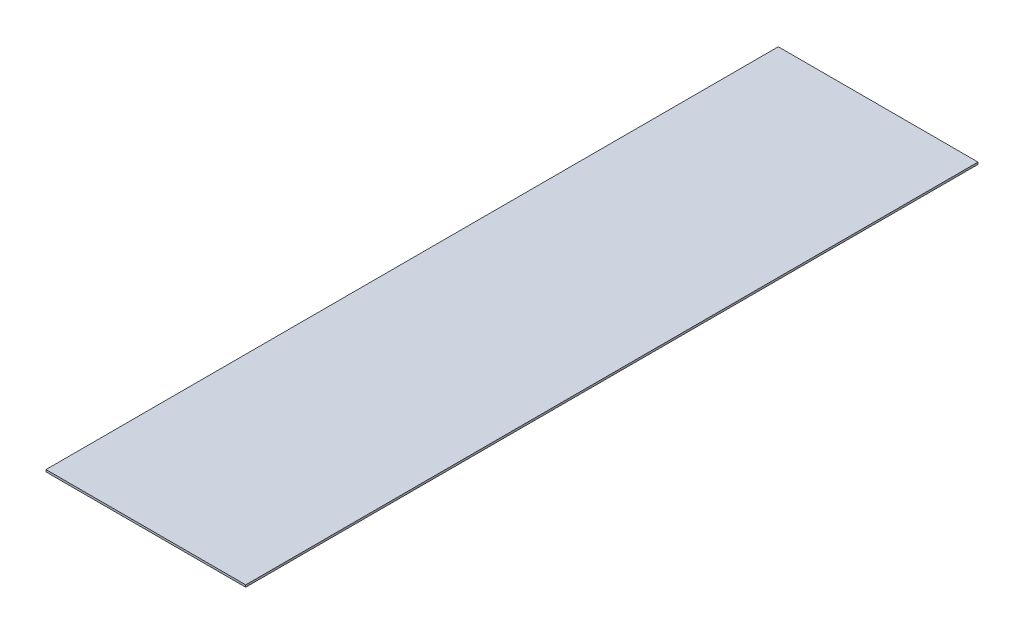
ISO-10303-21;
HEADER;
FILE_DESCRIPTION(('STEP AP214'),'2;1');
FILE_NAME('part.step','',(''),(''),'','','');
FILE_SCHEMA(('AUTOMOTIVE_DESIGN { 1 0 10303 214 1 1 1 1 }'));
ENDSEC;
DATA;
#1=APPLICATION_CONTEXT('core data for automotive mechanical design processes');
#2=APPLICATION_PROTOCOL_DEFINITION('international standard','automotive_design',2000,#1);
#3=PRODUCT_CONTEXT('',#1,'mechanical');
#4=PRODUCT('Part','Part','',(#3));
#5=PRODUCT_RELATED_PRODUCT_CATEGORY('part','',(#4));
#6=PRODUCT_DEFINITION_FORMATION('','',#4);
#7=PRODUCT_DEFINITION_CONTEXT('part definition',#1,'design');
#8=PRODUCT_DEFINITION('design','',#6,#7);
#9=PRODUCT_DEFINITION_SHAPE('','',#8);
#10=(LENGTH_UNIT() NAMED_UNIT(*) SI_UNIT(.MILLI.,.METRE.));
#11=(NAMED_UNIT(*) PLANE_ANGLE_UNIT() SI_UNIT($,.RADIAN.));
#12=(NAMED_UNIT(*) SI_UNIT($,.STERADIAN.) SOLID_ANGLE_UNIT());
#13=UNCERTAINTY_MEASURE_WITH_UNIT(LENGTH_MEASURE(1.E-05),#10,'distance_accuracy_value','');
#14=(GEOMETRIC_REPRESENTATION_CONTEXT(3) GLOBAL_UNCERTAINTY_ASSIGNED_CONTEXT((#13)) GLOBAL_UNIT_ASSIGNED_CONTEXT((#10,
#11,#12)) REPRESENTATION_CONTEXT('',''));
#15=CARTESIAN_POINT('',(0.,0.,0.));
#16=DIRECTION('',(0.,0.,1.));
#17=DIRECTION('',(1.,0.,0.));
#18=AXIS2_PLACEMENT_3D('',#15,#16,#17);
#19=CARTESIAN_POINT('',(-38.1,0.79375,-139.7));
#20=DIRECTION('',(1.,0.,0.));
#21=DIRECTION('',(0.,0.,-1.));
#22=AXIS2_PLACEMENT_3D('',#19,#20,#21);
#23=PLANE('',#22);
#24=DIRECTION('',(0.,0.,1.));
#25=VECTOR('',#24,1.);
#26=CARTESIAN_POINT('',(-38.1,0.,-139.7));
#27=LINE('',#26,#25);
#28=CARTESIAN_POINT('',(-38.1,0.,-139.7));
#29=VERTEX_POINT('',#28);
#30=CARTESIAN_POINT('',(-38.1,0.,139.7));
#31=VERTEX_POINT('',#30);
#32=EDGE_CURVE('E108',#29,#31,#27,.T.);
#33=ORIENTED_EDGE('',*,*,#32,.T.);
#34=DIRECTION('',(0.,-1.,0.));
#35=VECTOR('',#34,1.);
#36=CARTESIAN_POINT('',(-38.1,0.79375,139.7));
#37=LINE('',#36,#35);
#38=CARTESIAN_POINT('',(-38.1,0.79375,139.7));
#39=VERTEX_POINT('',#38);
#40=EDGE_CURVE('E11',#39,#31,#37,.T.);
#41=ORIENTED_EDGE('',*,*,#40,.F.);
#42=DIRECTION('',(0.,0.,1.));
#43=VECTOR('',#42,1.);
#44=CARTESIAN_POINT('',(-38.1,0.79375,-139.7));
#45=LINE('',#44,#43);
#46=CARTESIAN_POINT('',(-38.1,0.79375,-139.7));
#47=VERTEX_POINT('',#46);
#48=EDGE_CURVE('E92',#47,#39,#45,.T.);
#49=ORIENTED_EDGE('',*,*,#48,.F.);
#50=DIRECTION('',(0.,-1.,0.));
#51=VECTOR('',#50,1.);
#52=CARTESIAN_POINT('',(-38.1,0.79375,-139.7));
#53=LINE('',#52,#51);
#54=EDGE_CURVE('E104',#47,#29,#53,.T.);
#55=ORIENTED_EDGE('',*,*,#54,.T.);
#56=EDGE_LOOP('',(#33,#41,#49,#55));
#57=FACE_BOUND('',#56,.T.);
#58=ADVANCED_FACE('F40',(#57),#23,.F.);
#59=CARTESIAN_POINT('',(-38.1,0.79375,139.7));
#60=DIRECTION('',(0.,0.,-1.));
#61=DIRECTION('',(-1.,0.,0.));
#62=AXIS2_PLACEMENT_3D('',#59,#60,#61);
#63=PLANE('',#62);
#64=DIRECTION('',(1.,0.,0.));
#65=VECTOR('',#64,1.);
#66=CARTESIAN_POINT('',(-38.1,0.,139.7));
#67=LINE('',#66,#65);
#68=CARTESIAN_POINT('',(38.1,0.,139.7));
#69=VERTEX_POINT('',#68);
#70=EDGE_CURVE('E97',#31,#69,#67,.T.);
#71=ORIENTED_EDGE('',*,*,#70,.T.);
#72=DIRECTION('',(0.,-1.,0.));
#73=VECTOR('',#72,1.);
#74=CARTESIAN_POINT('',(38.1,0.79375,139.7));
#75=LINE('',#74,#73);
#76=CARTESIAN_POINT('',(38.1,0.79375,139.7));
#77=VERTEX_POINT('',#76);
#78=EDGE_CURVE('E49',#77,#69,#75,.T.);
#79=ORIENTED_EDGE('',*,*,#78,.F.);
#80=DIRECTION('',(1.,0.,0.));
#81=VECTOR('',#80,1.);
#82=CARTESIAN_POINT('',(-38.1,0.79375,139.7));
#83=LINE('',#82,#81);
#84=EDGE_CURVE('E87',#39,#77,#83,.T.);
#85=ORIENTED_EDGE('',*,*,#84,.F.);
#86=ORIENTED_EDGE('',*,*,#40,.T.);
#87=EDGE_LOOP('',(#71,#79,#85,#86));
#88=FACE_BOUND('',#87,.T.);
#89=ADVANCED_FACE('F96',(#88),#63,.F.);
#90=CARTESIAN_POINT('',(38.1,0.79375,-139.7));
#91=DIRECTION('',(-1.,0.,0.));
#92=DIRECTION('',(0.,0.,1.));
#93=AXIS2_PLACEMENT_3D('',#90,#91,#92);
#94=PLANE('',#93);
#95=DIRECTION('',(0.,0.,-1.));
#96=VECTOR('',#95,1.);
#97=CARTESIAN_POINT('',(38.1,0.,-139.7));
#98=LINE('',#97,#96);
#99=CARTESIAN_POINT('',(38.1,0.,-139.7));
#100=VERTEX_POINT('',#99);
#101=EDGE_CURVE('E74',#69,#100,#98,.T.);
#102=ORIENTED_EDGE('',*,*,#101,.T.);
#103=DIRECTION('',(0.,-1.,0.));
#104=VECTOR('',#103,1.);
#105=CARTESIAN_POINT('',(38.1,0.79375,-139.7));
#106=LINE('',#105,#104);
#107=CARTESIAN_POINT('',(38.1,0.79375,-139.7));
#108=VERTEX_POINT('',#107);
#109=EDGE_CURVE('E99',#108,#100,#106,.T.);
#110=ORIENTED_EDGE('',*,*,#109,.F.);
#111=DIRECTION('',(0.,0.,-1.));
#112=VECTOR('',#111,1.);
#113=CARTESIAN_POINT('',(38.1,0.79375,-139.7));
#114=LINE('',#113,#112);
#115=EDGE_CURVE('E90',#77,#108,#114,.T.);
#116=ORIENTED_EDGE('',*,*,#115,.F.);
#117=ORIENTED_EDGE('',*,*,#78,.T.);
#118=EDGE_LOOP('',(#102,#110,#116,#117));
#119=FACE_BOUND('',#118,.T.);
#120=ADVANCED_FACE('F100',(#119),#94,.F.);
#121=CARTESIAN_POINT('',(-38.1,0.79375,-139.7));
#122=DIRECTION('',(0.,0.,1.));
#123=DIRECTION('',(1.,0.,0.));
#124=AXIS2_PLACEMENT_3D('',#121,#122,#123);
#125=PLANE('',#124);
#126=DIRECTION('',(-1.,0.,0.));
#127=VECTOR('',#126,1.);
#128=CARTESIAN_POINT('',(-38.1,0.,-139.7));
#129=LINE('',#128,#127);
#130=EDGE_CURVE('E80',#100,#29,#129,.T.);
#131=ORIENTED_EDGE('',*,*,#130,.T.);
#132=ORIENTED_EDGE('',*,*,#54,.F.);
#133=DIRECTION('',(-1.,0.,0.));
#134=VECTOR('',#133,1.);
#135=CARTESIAN_POINT('',(-38.1,0.79375,-139.7));
#136=LINE('',#135,#134);
#137=EDGE_CURVE('E57',#108,#47,#136,.T.);
#138=ORIENTED_EDGE('',*,*,#137,.F.);
#139=ORIENTED_EDGE('',*,*,#109,.T.);
#140=EDGE_LOOP('',(#131,#132,#138,#139));
#141=FACE_BOUND('',#140,.T.);
#142=ADVANCED_FACE('F121',(#141),#125,.F.);
#143=CARTESIAN_POINT('',(-38.1,0.79375,139.7));
#144=DIRECTION('',(0.,1.,0.));
#145=DIRECTION('',(0.,0.,1.));
#146=AXIS2_PLACEMENT_3D('',#143,#144,#145);
#147=PLANE('',#146);
#148=ORIENTED_EDGE('',*,*,#48,.T.);
#149=ORIENTED_EDGE('',*,*,#84,.T.);
#150=ORIENTED_EDGE('',*,*,#115,.T.);
#151=ORIENTED_EDGE('',*,*,#137,.T.);
#152=EDGE_LOOP('',(#148,#149,#150,#151));
#153=FACE_BOUND('',#152,.T.);
#154=ADVANCED_FACE('F88',(#153),#147,.T.);
#155=CARTESIAN_POINT('',(-38.1,0.,139.7));
#156=DIRECTION('',(0.,1.,0.));
#157=DIRECTION('',(0.,0.,1.));
#158=AXIS2_PLACEMENT_3D('',#155,#156,#157);
#159=PLANE('',#158);
#160=ORIENTED_EDGE('',*,*,#32,.F.);
#161=ORIENTED_EDGE('',*,*,#130,.F.);
#162=ORIENTED_EDGE('',*,*,#101,.F.);
#163=ORIENTED_EDGE('',*,*,#70,.F.);
#164=EDGE_LOOP('',(#160,#161,#162,#163));
#165=FACE_BOUND('',#164,.T.);
#166=ADVANCED_FACE('F124',(#165),#159,.F.);
#167=CLOSED_SHELL('',(#58,#89,#120,#142,#154,#166));
#168=MANIFOLD_SOLID_BREP('B2',#167);
#169=ADVANCED_BREP_SHAPE_REPRESENTATION('',(#18,#168),#14);
#170=SHAPE_DEFINITION_REPRESENTATION(#9,#169);
ENDSEC;
END-ISO-10303-21;
